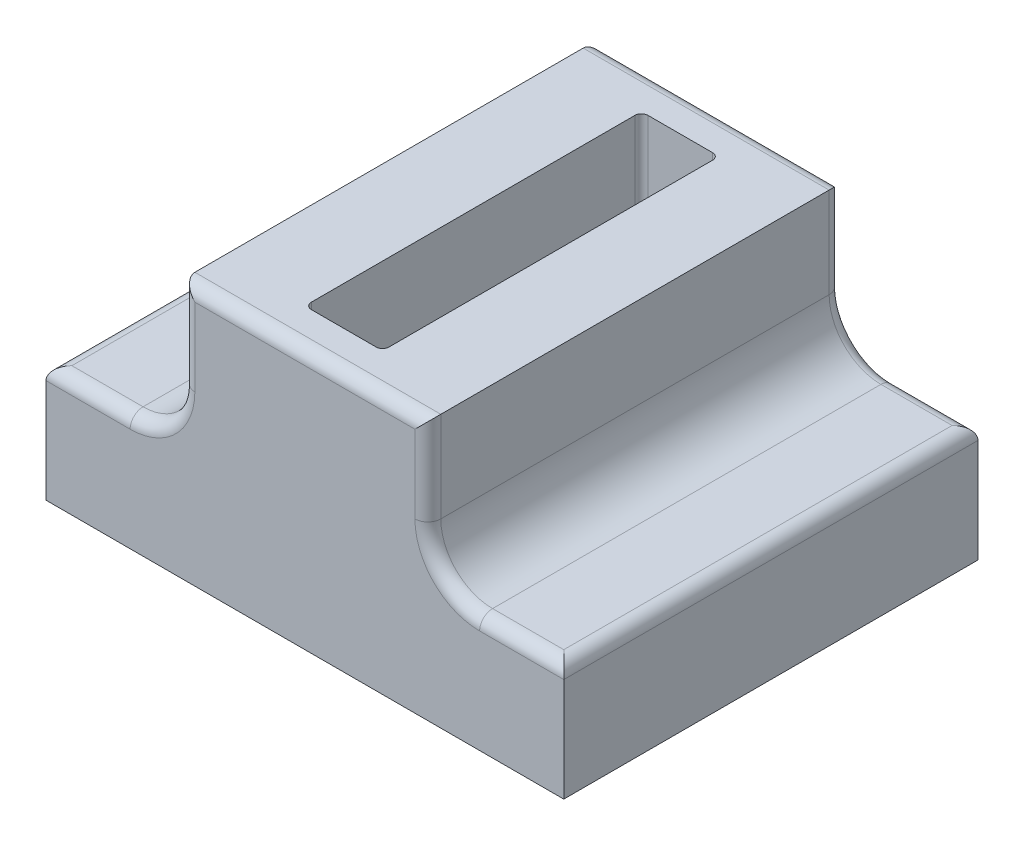
ISO-10303-21;
HEADER;
FILE_DESCRIPTION(('STEP AP214'),'2;1');
FILE_NAME('part.step','',(''),(''),'','','');
FILE_SCHEMA(('AUTOMOTIVE_DESIGN { 1 0 10303 214 1 1 1 1 }'));
ENDSEC;
DATA;
#1=APPLICATION_CONTEXT('core data for automotive mechanical design processes');
#2=APPLICATION_PROTOCOL_DEFINITION('international standard','automotive_design',2000,#1);
#3=PRODUCT_CONTEXT('',#1,'mechanical');
#4=PRODUCT('Part','Part','',(#3));
#5=PRODUCT_RELATED_PRODUCT_CATEGORY('part','',(#4));
#6=PRODUCT_DEFINITION_FORMATION('','',#4);
#7=PRODUCT_DEFINITION_CONTEXT('part definition',#1,'design');
#8=PRODUCT_DEFINITION('design','',#6,#7);
#9=PRODUCT_DEFINITION_SHAPE('','',#8);
#10=(LENGTH_UNIT() NAMED_UNIT(*) SI_UNIT(.MILLI.,.METRE.));
#11=(NAMED_UNIT(*) PLANE_ANGLE_UNIT() SI_UNIT($,.RADIAN.));
#12=(NAMED_UNIT(*) SI_UNIT($,.STERADIAN.) SOLID_ANGLE_UNIT());
#13=UNCERTAINTY_MEASURE_WITH_UNIT(LENGTH_MEASURE(1.E-05),#10,'distance_accuracy_value','');
#14=(GEOMETRIC_REPRESENTATION_CONTEXT(3) GLOBAL_UNCERTAINTY_ASSIGNED_CONTEXT((#13)) GLOBAL_UNIT_ASSIGNED_CONTEXT((#10,
#11,#12)) REPRESENTATION_CONTEXT('',''));
#15=CARTESIAN_POINT('',(0.,0.,0.));
#16=DIRECTION('',(0.,0.,1.));
#17=DIRECTION('',(1.,0.,0.));
#18=AXIS2_PLACEMENT_3D('',#15,#16,#17);
#19=CARTESIAN_POINT('',(0.,4.5,0.));
#20=DIRECTION('',(0.,1.,0.));
#21=DIRECTION('',(0.,0.,1.));
#22=AXIS2_PLACEMENT_3D('',#19,#20,#21);
#23=PLANE('',#22);
#24=DIRECTION('',(0.,0.,1.));
#25=VECTOR('',#24,1.);
#26=CARTESIAN_POINT('',(3.25,4.5,0.));
#27=LINE('',#26,#25);
#28=CARTESIAN_POINT('',(3.25,4.5,15.5));
#29=VERTEX_POINT('',#28);
#30=CARTESIAN_POINT('',(3.25,4.5,0.5));
#31=VERTEX_POINT('',#30);
#32=EDGE_CURVE('E277',#29,#31,#27,.F.);
#33=ORIENTED_EDGE('',*,*,#32,.T.);
#34=DIRECTION('',(-1.,0.,0.));
#35=VECTOR('',#34,1.);
#36=CARTESIAN_POINT('',(0.,4.5,0.5));
#37=LINE('',#36,#35);
#38=CARTESIAN_POINT('',(0.5,4.5,0.5));
#39=VERTEX_POINT('',#38);
#40=EDGE_CURVE('E295',#31,#39,#37,.T.);
#41=ORIENTED_EDGE('',*,*,#40,.T.);
#42=DIRECTION('',(0.,0.,1.));
#43=VECTOR('',#42,1.);
#44=CARTESIAN_POINT('',(0.5,4.5,16.));
#45=LINE('',#44,#43);
#46=CARTESIAN_POINT('',(0.5,4.5,15.5));
#47=VERTEX_POINT('',#46);
#48=EDGE_CURVE('E292',#39,#47,#45,.T.);
#49=ORIENTED_EDGE('',*,*,#48,.T.);
#50=DIRECTION('',(1.,0.,0.));
#51=VECTOR('',#50,1.);
#52=CARTESIAN_POINT('',(3.25,4.5,15.5));
#53=LINE('',#52,#51);
#54=EDGE_CURVE('E289',#47,#29,#53,.T.);
#55=ORIENTED_EDGE('',*,*,#54,.T.);
#56=EDGE_LOOP('',(#33,#41,#49,#55));
#57=FACE_BOUND('',#56,.T.);
#58=ADVANCED_FACE('F48',(#57),#23,.T.);
#59=DIRECTION('',(0.,0.,-1.));
#60=VECTOR('',#59,1.);
#61=CARTESIAN_POINT('',(19.5,4.5,0.));
#62=LINE('',#61,#60);
#63=CARTESIAN_POINT('',(19.5,4.5,15.5));
#64=VERTEX_POINT('',#63);
#65=CARTESIAN_POINT('',(19.5,4.5,0.5));
#66=VERTEX_POINT('',#65);
#67=EDGE_CURVE('E333',#64,#66,#62,.T.);
#68=ORIENTED_EDGE('',*,*,#67,.T.);
#69=DIRECTION('',(-1.,0.,0.));
#70=VECTOR('',#69,1.);
#71=CARTESIAN_POINT('',(16.75,4.5,0.5));
#72=LINE('',#71,#70);
#73=CARTESIAN_POINT('',(16.75,4.5,0.5));
#74=VERTEX_POINT('',#73);
#75=EDGE_CURVE('E339',#66,#74,#72,.T.);
#76=ORIENTED_EDGE('',*,*,#75,.T.);
#77=DIRECTION('',(0.,0.,-1.));
#78=VECTOR('',#77,1.);
#79=CARTESIAN_POINT('',(16.75,4.5,0.));
#80=LINE('',#79,#78);
#81=CARTESIAN_POINT('',(16.75,4.5,15.5));
#82=VERTEX_POINT('',#81);
#83=EDGE_CURVE('E285',#74,#82,#80,.F.);
#84=ORIENTED_EDGE('',*,*,#83,.T.);
#85=DIRECTION('',(1.,0.,0.));
#86=VECTOR('',#85,1.);
#87=CARTESIAN_POINT('',(20.,4.5,15.5));
#88=LINE('',#87,#86);
#89=EDGE_CURVE('E336',#82,#64,#88,.T.);
#90=ORIENTED_EDGE('',*,*,#89,.T.);
#91=EDGE_LOOP('',(#68,#76,#84,#90));
#92=FACE_BOUND('',#91,.T.);
#93=ADVANCED_FACE('F569',(#92),#23,.T.);
#94=CARTESIAN_POINT('',(0.,0.,0.));
#95=DIRECTION('',(0.,1.,0.));
#96=DIRECTION('',(0.,0.,1.));
#97=AXIS2_PLACEMENT_3D('',#94,#95,#96);
#98=PLANE('',#97);
#99=DIRECTION('',(0.,0.,1.));
#100=VECTOR('',#99,1.);
#101=CARTESIAN_POINT('',(0.,0.,0.));
#102=LINE('',#101,#100);
#103=CARTESIAN_POINT('',(0.,0.,0.));
#104=VERTEX_POINT('',#103);
#105=CARTESIAN_POINT('',(0.,0.,16.));
#106=VERTEX_POINT('',#105);
#107=EDGE_CURVE('E244',#104,#106,#102,.T.);
#108=ORIENTED_EDGE('',*,*,#107,.F.);
#109=DIRECTION('',(-1.,0.,0.));
#110=VECTOR('',#109,1.);
#111=CARTESIAN_POINT('',(0.,0.,0.));
#112=LINE('',#111,#110);
#113=CARTESIAN_POINT('',(20.,0.,0.));
#114=VERTEX_POINT('',#113);
#115=EDGE_CURVE('E264',#114,#104,#112,.T.);
#116=ORIENTED_EDGE('',*,*,#115,.F.);
#117=DIRECTION('',(0.,0.,-1.));
#118=VECTOR('',#117,1.);
#119=CARTESIAN_POINT('',(20.,0.,0.));
#120=LINE('',#119,#118);
#121=CARTESIAN_POINT('',(20.,0.,16.));
#122=VERTEX_POINT('',#121);
#123=EDGE_CURVE('E246',#122,#114,#120,.T.);
#124=ORIENTED_EDGE('',*,*,#123,.F.);
#125=DIRECTION('',(1.,0.,0.));
#126=VECTOR('',#125,1.);
#127=CARTESIAN_POINT('',(0.,0.,16.));
#128=LINE('',#127,#126);
#129=EDGE_CURVE('E228',#106,#122,#128,.T.);
#130=ORIENTED_EDGE('',*,*,#129,.F.);
#131=EDGE_LOOP('',(#108,#116,#124,#130));
#132=FACE_BOUND('',#131,.T.);
#133=DIRECTION('',(-1.,0.,0.));
#134=VECTOR('',#133,1.);
#135=CARTESIAN_POINT('',(8.5,0.,1.5));
#136=LINE('',#135,#134);
#137=CARTESIAN_POINT('',(11.25,0.,1.5));
#138=VERTEX_POINT('',#137);
#139=CARTESIAN_POINT('',(8.75,0.,1.5));
#140=VERTEX_POINT('',#139);
#141=EDGE_CURVE('E254',#138,#140,#136,.T.);
#142=ORIENTED_EDGE('',*,*,#141,.T.);
#143=CARTESIAN_POINT('',(8.75,0.,1.75));
#144=DIRECTION('',(0.,1.,0.));
#145=DIRECTION('',(0.,0.,1.));
#146=AXIS2_PLACEMENT_3D('',#143,#144,#145);
#147=CIRCLE('',#146,0.25);
#148=CARTESIAN_POINT('',(8.5,0.,1.75));
#149=VERTEX_POINT('',#148);
#150=EDGE_CURVE('E57',#140,#149,#147,.T.);
#151=ORIENTED_EDGE('',*,*,#150,.T.);
#152=DIRECTION('',(0.,0.,1.));
#153=VECTOR('',#152,1.);
#154=CARTESIAN_POINT('',(8.5,0.,1.5));
#155=LINE('',#154,#153);
#156=CARTESIAN_POINT('',(8.5,0.,14.25));
#157=VERTEX_POINT('',#156);
#158=EDGE_CURVE('E496',#149,#157,#155,.T.);
#159=ORIENTED_EDGE('',*,*,#158,.T.);
#160=CARTESIAN_POINT('',(8.75,0.,14.25));
#161=DIRECTION('',(0.,1.,0.));
#162=DIRECTION('',(0.,0.,1.));
#163=AXIS2_PLACEMENT_3D('',#160,#161,#162);
#164=CIRCLE('',#163,0.25);
#165=CARTESIAN_POINT('',(8.75,0.,14.5));
#166=VERTEX_POINT('',#165);
#167=EDGE_CURVE('E476',#157,#166,#164,.T.);
#168=ORIENTED_EDGE('',*,*,#167,.T.);
#169=DIRECTION('',(1.,0.,0.));
#170=VECTOR('',#169,1.);
#171=CARTESIAN_POINT('',(8.5,0.,14.5));
#172=LINE('',#171,#170);
#173=CARTESIAN_POINT('',(11.25,0.,14.5));
#174=VERTEX_POINT('',#173);
#175=EDGE_CURVE('E505',#166,#174,#172,.T.);
#176=ORIENTED_EDGE('',*,*,#175,.T.);
#177=CARTESIAN_POINT('',(11.25,0.,14.25));
#178=DIRECTION('',(0.,1.,0.));
#179=DIRECTION('',(0.,0.,1.));
#180=AXIS2_PLACEMENT_3D('',#177,#178,#179);
#181=CIRCLE('',#180,0.25);
#182=CARTESIAN_POINT('',(11.5,0.,14.25));
#183=VERTEX_POINT('',#182);
#184=EDGE_CURVE('E482',#174,#183,#181,.T.);
#185=ORIENTED_EDGE('',*,*,#184,.T.);
#186=DIRECTION('',(0.,0.,-1.));
#187=VECTOR('',#186,1.);
#188=CARTESIAN_POINT('',(11.5,0.,1.5));
#189=LINE('',#188,#187);
#190=CARTESIAN_POINT('',(11.5,0.,1.75));
#191=VERTEX_POINT('',#190);
#192=EDGE_CURVE('E258',#183,#191,#189,.T.);
#193=ORIENTED_EDGE('',*,*,#192,.T.);
#194=CARTESIAN_POINT('',(11.25,0.,1.75));
#195=DIRECTION('',(0.,1.,0.));
#196=DIRECTION('',(0.,0.,1.));
#197=AXIS2_PLACEMENT_3D('',#194,#195,#196);
#198=CIRCLE('',#197,0.25);
#199=EDGE_CURVE('E488',#191,#138,#198,.T.);
#200=ORIENTED_EDGE('',*,*,#199,.T.);
#201=EDGE_LOOP('',(#142,#151,#159,#168,#176,#185,#193,#200));
#202=FACE_BOUND('',#201,.T.);
#203=ADVANCED_FACE('F241',(#132,#202),#98,.F.);
#204=CARTESIAN_POINT('',(0.,4.5,0.));
#205=DIRECTION('',(1.,0.,0.));
#206=DIRECTION('',(0.,0.,-1.));
#207=AXIS2_PLACEMENT_3D('',#204,#205,#206);
#208=PLANE('',#207);
#209=DIRECTION('',(0.,-1.,0.));
#210=VECTOR('',#209,1.);
#211=CARTESIAN_POINT('',(0.,4.5,16.));
#212=LINE('',#211,#210);
#213=CARTESIAN_POINT('',(0.,4.,16.));
#214=VERTEX_POINT('',#213);
#215=EDGE_CURVE('E224',#214,#106,#212,.T.);
#216=ORIENTED_EDGE('',*,*,#215,.F.);
#217=DIRECTION('',(0.,0.,1.));
#218=VECTOR('',#217,1.);
#219=CARTESIAN_POINT('',(0.,4.,0.));
#220=LINE('',#219,#218);
#221=CARTESIAN_POINT('',(0.,4.,0.));
#222=VERTEX_POINT('',#221);
#223=EDGE_CURVE('E368',#214,#222,#220,.F.);
#224=ORIENTED_EDGE('',*,*,#223,.T.);
#225=DIRECTION('',(0.,-1.,0.));
#226=VECTOR('',#225,1.);
#227=CARTESIAN_POINT('',(0.,4.5,0.));
#228=LINE('',#227,#226);
#229=EDGE_CURVE('E251',#222,#104,#228,.T.);
#230=ORIENTED_EDGE('',*,*,#229,.T.);
#231=ORIENTED_EDGE('',*,*,#107,.T.);
#232=EDGE_LOOP('',(#216,#224,#230,#231));
#233=FACE_BOUND('',#232,.T.);
#234=ADVANCED_FACE('F249',(#233),#208,.F.);
#235=CARTESIAN_POINT('',(0.,4.5,16.));
#236=DIRECTION('',(0.,0.,-1.));
#237=DIRECTION('',(-1.,0.,0.));
#238=AXIS2_PLACEMENT_3D('',#235,#236,#237);
#239=PLANE('',#238);
#240=DIRECTION('',(0.,-1.,0.));
#241=VECTOR('',#240,1.);
#242=CARTESIAN_POINT('',(20.,4.5,16.));
#243=LINE('',#242,#241);
#244=CARTESIAN_POINT('',(20.,4.,16.));
#245=VERTEX_POINT('',#244);
#246=EDGE_CURVE('E237',#245,#122,#243,.T.);
#247=ORIENTED_EDGE('',*,*,#246,.F.);
#248=DIRECTION('',(1.,0.,0.));
#249=VECTOR('',#248,1.);
#250=CARTESIAN_POINT('',(16.75,4.,16.));
#251=LINE('',#250,#249);
#252=CARTESIAN_POINT('',(16.75,4.,16.));
#253=VERTEX_POINT('',#252);
#254=EDGE_CURVE('E359',#245,#253,#251,.F.);
#255=ORIENTED_EDGE('',*,*,#254,.T.);
#256=CARTESIAN_POINT('',(16.75,6.5,16.));
#257=DIRECTION('',(0.,0.,-1.));
#258=DIRECTION('',(-1.,0.,0.));
#259=AXIS2_PLACEMENT_3D('',#256,#257,#258);
#260=CIRCLE('',#259,2.5);
#261=CARTESIAN_POINT('',(14.25,6.5,16.));
#262=VERTEX_POINT('',#261);
#263=EDGE_CURVE('E356',#253,#262,#260,.T.);
#264=ORIENTED_EDGE('',*,*,#263,.T.);
#265=DIRECTION('',(0.,-1.,0.));
#266=VECTOR('',#265,1.);
#267=CARTESIAN_POINT('',(14.25,4.5,16.));
#268=LINE('',#267,#266);
#269=CARTESIAN_POINT('',(14.25,9.5,16.));
#270=VERTEX_POINT('',#269);
#271=EDGE_CURVE('E353',#262,#270,#268,.F.);
#272=ORIENTED_EDGE('',*,*,#271,.T.);
#273=DIRECTION('',(1.,0.,0.));
#274=VECTOR('',#273,1.);
#275=CARTESIAN_POINT('',(5.25,9.5,16.));
#276=LINE('',#275,#274);
#277=CARTESIAN_POINT('',(5.75,9.5,16.));
#278=VERTEX_POINT('',#277);
#279=EDGE_CURVE('E350',#270,#278,#276,.F.);
#280=ORIENTED_EDGE('',*,*,#279,.T.);
#281=DIRECTION('',(0.,-1.,0.));
#282=VECTOR('',#281,1.);
#283=CARTESIAN_POINT('',(5.75,4.5,16.));
#284=LINE('',#283,#282);
#285=CARTESIAN_POINT('',(5.75,6.5,16.));
#286=VERTEX_POINT('',#285);
#287=EDGE_CURVE('E347',#278,#286,#284,.T.);
#288=ORIENTED_EDGE('',*,*,#287,.T.);
#289=CARTESIAN_POINT('',(3.25,6.5,16.));
#290=DIRECTION('',(0.,0.,-1.));
#291=DIRECTION('',(-1.,0.,0.));
#292=AXIS2_PLACEMENT_3D('',#289,#290,#291);
#293=CIRCLE('',#292,2.5);
#294=CARTESIAN_POINT('',(3.25,4.,16.));
#295=VERTEX_POINT('',#294);
#296=EDGE_CURVE('E344',#286,#295,#293,.T.);
#297=ORIENTED_EDGE('',*,*,#296,.T.);
#298=DIRECTION('',(1.,0.,0.));
#299=VECTOR('',#298,1.);
#300=CARTESIAN_POINT('',(0.,4.,16.));
#301=LINE('',#300,#299);
#302=EDGE_CURVE('E231',#295,#214,#301,.F.);
#303=ORIENTED_EDGE('',*,*,#302,.T.);
#304=ORIENTED_EDGE('',*,*,#215,.T.);
#305=ORIENTED_EDGE('',*,*,#129,.T.);
#306=EDGE_LOOP('',(#247,#255,#264,#272,#280,#288,#297,#303,#304,#305));
#307=FACE_BOUND('',#306,.T.);
#308=ADVANCED_FACE('F227',(#307),#239,.F.);
#309=CARTESIAN_POINT('',(20.,4.5,0.));
#310=DIRECTION('',(-1.,0.,0.));
#311=DIRECTION('',(0.,0.,1.));
#312=AXIS2_PLACEMENT_3D('',#309,#310,#311);
#313=PLANE('',#312);
#314=DIRECTION('',(0.,-1.,0.));
#315=VECTOR('',#314,1.);
#316=CARTESIAN_POINT('',(20.,4.5,0.));
#317=LINE('',#316,#315);
#318=CARTESIAN_POINT('',(20.,4.,0.));
#319=VERTEX_POINT('',#318);
#320=EDGE_CURVE('E269',#319,#114,#317,.T.);
#321=ORIENTED_EDGE('',*,*,#320,.F.);
#322=DIRECTION('',(0.,0.,-1.));
#323=VECTOR('',#322,1.);
#324=CARTESIAN_POINT('',(20.,4.,16.));
#325=LINE('',#324,#323);
#326=EDGE_CURVE('E371',#319,#245,#325,.F.);
#327=ORIENTED_EDGE('',*,*,#326,.T.);
#328=ORIENTED_EDGE('',*,*,#246,.T.);
#329=ORIENTED_EDGE('',*,*,#123,.T.);
#330=EDGE_LOOP('',(#321,#327,#328,#329));
#331=FACE_BOUND('',#330,.T.);
#332=ADVANCED_FACE('F584',(#331),#313,.F.);
#333=CARTESIAN_POINT('',(0.,4.5,0.));
#334=DIRECTION('',(0.,0.,1.));
#335=DIRECTION('',(1.,0.,0.));
#336=AXIS2_PLACEMENT_3D('',#333,#334,#335);
#337=PLANE('',#336);
#338=ORIENTED_EDGE('',*,*,#229,.F.);
#339=DIRECTION('',(-1.,0.,0.));
#340=VECTOR('',#339,1.);
#341=CARTESIAN_POINT('',(3.25,4.,0.));
#342=LINE('',#341,#340);
#343=CARTESIAN_POINT('',(3.25,4.,0.));
#344=VERTEX_POINT('',#343);
#345=EDGE_CURVE('E317',#222,#344,#342,.F.);
#346=ORIENTED_EDGE('',*,*,#345,.T.);
#347=CARTESIAN_POINT('',(3.25,6.5,0.));
#348=DIRECTION('',(0.,0.,1.));
#349=DIRECTION('',(1.,0.,0.));
#350=AXIS2_PLACEMENT_3D('',#347,#348,#349);
#351=CIRCLE('',#350,2.5);
#352=CARTESIAN_POINT('',(5.75,6.5,0.));
#353=VERTEX_POINT('',#352);
#354=EDGE_CURVE('E314',#344,#353,#351,.T.);
#355=ORIENTED_EDGE('',*,*,#354,.T.);
#356=DIRECTION('',(0.,-1.,0.));
#357=VECTOR('',#356,1.);
#358=CARTESIAN_POINT('',(5.75,4.5,0.));
#359=LINE('',#358,#357);
#360=CARTESIAN_POINT('',(5.75,9.5,0.));
#361=VERTEX_POINT('',#360);
#362=EDGE_CURVE('E311',#353,#361,#359,.F.);
#363=ORIENTED_EDGE('',*,*,#362,.T.);
#364=DIRECTION('',(-1.,0.,0.));
#365=VECTOR('',#364,1.);
#366=CARTESIAN_POINT('',(14.75,9.5,0.));
#367=LINE('',#366,#365);
#368=CARTESIAN_POINT('',(14.25,9.5,0.));
#369=VERTEX_POINT('',#368);
#370=EDGE_CURVE('E308',#361,#369,#367,.F.);
#371=ORIENTED_EDGE('',*,*,#370,.T.);
#372=DIRECTION('',(0.,-1.,0.));
#373=VECTOR('',#372,1.);
#374=CARTESIAN_POINT('',(14.25,4.5,0.));
#375=LINE('',#374,#373);
#376=CARTESIAN_POINT('',(14.25,6.5,0.));
#377=VERTEX_POINT('',#376);
#378=EDGE_CURVE('E305',#369,#377,#375,.T.);
#379=ORIENTED_EDGE('',*,*,#378,.T.);
#380=CARTESIAN_POINT('',(16.75,6.5,0.));
#381=DIRECTION('',(0.,0.,1.));
#382=DIRECTION('',(1.,0.,0.));
#383=AXIS2_PLACEMENT_3D('',#380,#381,#382);
#384=CIRCLE('',#383,2.5);
#385=CARTESIAN_POINT('',(16.75,4.,0.));
#386=VERTEX_POINT('',#385);
#387=EDGE_CURVE('E299',#377,#386,#384,.T.);
#388=ORIENTED_EDGE('',*,*,#387,.T.);
#389=DIRECTION('',(-1.,0.,0.));
#390=VECTOR('',#389,1.);
#391=CARTESIAN_POINT('',(20.,4.,0.));
#392=LINE('',#391,#390);
#393=EDGE_CURVE('E302',#386,#319,#392,.F.);
#394=ORIENTED_EDGE('',*,*,#393,.T.);
#395=ORIENTED_EDGE('',*,*,#320,.T.);
#396=ORIENTED_EDGE('',*,*,#115,.T.);
#397=EDGE_LOOP('',(#338,#346,#355,#363,#371,#379,#388,#394,#395,#396));
#398=FACE_BOUND('',#397,.T.);
#399=ADVANCED_FACE('F581',(#398),#337,.F.);
#400=CARTESIAN_POINT('',(8.5,4.5,1.5));
#401=DIRECTION('',(1.,0.,0.));
#402=DIRECTION('',(0.,0.,-1.));
#403=AXIS2_PLACEMENT_3D('',#400,#401,#402);
#404=PLANE('',#403);
#405=DIRECTION('',(0.,0.,1.));
#406=VECTOR('',#405,1.);
#407=CARTESIAN_POINT('',(8.5,10.,1.5));
#408=LINE('',#407,#406);
#409=CARTESIAN_POINT('',(8.5,10.,1.75));
#410=VERTEX_POINT('',#409);
#411=CARTESIAN_POINT('',(8.5,10.,14.25));
#412=VERTEX_POINT('',#411);
#413=EDGE_CURVE('E449',#410,#412,#408,.T.);
#414=ORIENTED_EDGE('',*,*,#413,.T.);
#415=DIRECTION('',(0.,-1.,0.));
#416=VECTOR('',#415,1.);
#417=CARTESIAN_POINT('',(8.5,0.,14.25));
#418=LINE('',#417,#416);
#419=EDGE_CURVE('E452',#412,#157,#418,.T.);
#420=ORIENTED_EDGE('',*,*,#419,.T.);
#421=ORIENTED_EDGE('',*,*,#158,.F.);
#422=DIRECTION('',(0.,-1.,0.));
#423=VECTOR('',#422,1.);
#424=CARTESIAN_POINT('',(8.5,10.,1.75));
#425=LINE('',#424,#423);
#426=EDGE_CURVE('E386',#149,#410,#425,.F.);
#427=ORIENTED_EDGE('',*,*,#426,.T.);
#428=EDGE_LOOP('',(#414,#420,#421,#427));
#429=FACE_BOUND('',#428,.T.);
#430=ADVANCED_FACE('F502',(#429),#404,.T.);
#431=CARTESIAN_POINT('',(8.5,4.5,14.5));
#432=DIRECTION('',(0.,0.,-1.));
#433=DIRECTION('',(-1.,0.,0.));
#434=AXIS2_PLACEMENT_3D('',#431,#432,#433);
#435=PLANE('',#434);
#436=ORIENTED_EDGE('',*,*,#175,.F.);
#437=DIRECTION('',(0.,-1.,0.));
#438=VECTOR('',#437,1.);
#439=CARTESIAN_POINT('',(8.75,10.,14.5));
#440=LINE('',#439,#438);
#441=CARTESIAN_POINT('',(8.75,10.,14.5));
#442=VERTEX_POINT('',#441);
#443=EDGE_CURVE('E460',#166,#442,#440,.F.);
#444=ORIENTED_EDGE('',*,*,#443,.T.);
#445=DIRECTION('',(1.,0.,0.));
#446=VECTOR('',#445,1.);
#447=CARTESIAN_POINT('',(8.5,10.,14.5));
#448=LINE('',#447,#446);
#449=CARTESIAN_POINT('',(11.25,10.,14.5));
#450=VERTEX_POINT('',#449);
#451=EDGE_CURVE('E520',#442,#450,#448,.T.);
#452=ORIENTED_EDGE('',*,*,#451,.T.);
#453=DIRECTION('',(0.,-1.,0.));
#454=VECTOR('',#453,1.);
#455=CARTESIAN_POINT('',(11.25,0.,14.5));
#456=LINE('',#455,#454);
#457=EDGE_CURVE('E456',#450,#174,#456,.T.);
#458=ORIENTED_EDGE('',*,*,#457,.T.);
#459=EDGE_LOOP('',(#436,#444,#452,#458));
#460=FACE_BOUND('',#459,.T.);
#461=ADVANCED_FACE('F547',(#460),#435,.T.);
#462=CARTESIAN_POINT('',(11.5,4.5,1.5));
#463=DIRECTION('',(-1.,0.,0.));
#464=DIRECTION('',(0.,0.,1.));
#465=AXIS2_PLACEMENT_3D('',#462,#463,#464);
#466=PLANE('',#465);
#467=ORIENTED_EDGE('',*,*,#192,.F.);
#468=DIRECTION('',(0.,-1.,0.));
#469=VECTOR('',#468,1.);
#470=CARTESIAN_POINT('',(11.5,10.,14.25));
#471=LINE('',#470,#469);
#472=CARTESIAN_POINT('',(11.5,10.,14.25));
#473=VERTEX_POINT('',#472);
#474=EDGE_CURVE('E467',#183,#473,#471,.F.);
#475=ORIENTED_EDGE('',*,*,#474,.T.);
#476=DIRECTION('',(0.,0.,-1.));
#477=VECTOR('',#476,1.);
#478=CARTESIAN_POINT('',(11.5,10.,1.5));
#479=LINE('',#478,#477);
#480=CARTESIAN_POINT('',(11.5,10.,1.75));
#481=VERTEX_POINT('',#480);
#482=EDGE_CURVE('E513',#473,#481,#479,.T.);
#483=ORIENTED_EDGE('',*,*,#482,.T.);
#484=DIRECTION('',(0.,-1.,0.));
#485=VECTOR('',#484,1.);
#486=CARTESIAN_POINT('',(11.5,0.,1.75));
#487=LINE('',#486,#485);
#488=EDGE_CURVE('E463',#481,#191,#487,.T.);
#489=ORIENTED_EDGE('',*,*,#488,.T.);
#490=EDGE_LOOP('',(#467,#475,#483,#489));
#491=FACE_BOUND('',#490,.T.);
#492=ADVANCED_FACE('F534',(#491),#466,.T.);
#493=CARTESIAN_POINT('',(8.5,4.5,1.5));
#494=DIRECTION('',(0.,0.,1.));
#495=DIRECTION('',(1.,0.,0.));
#496=AXIS2_PLACEMENT_3D('',#493,#494,#495);
#497=PLANE('',#496);
#498=ORIENTED_EDGE('',*,*,#141,.F.);
#499=DIRECTION('',(0.,-1.,0.));
#500=VECTOR('',#499,1.);
#501=CARTESIAN_POINT('',(11.25,10.,1.5));
#502=LINE('',#501,#500);
#503=CARTESIAN_POINT('',(11.25,10.,1.5));
#504=VERTEX_POINT('',#503);
#505=EDGE_CURVE('E69',#138,#504,#502,.F.);
#506=ORIENTED_EDGE('',*,*,#505,.T.);
#507=DIRECTION('',(-1.,0.,0.));
#508=VECTOR('',#507,1.);
#509=CARTESIAN_POINT('',(8.5,10.,1.5));
#510=LINE('',#509,#508);
#511=CARTESIAN_POINT('',(8.75,10.,1.5));
#512=VERTEX_POINT('',#511);
#513=EDGE_CURVE('E509',#504,#512,#510,.T.);
#514=ORIENTED_EDGE('',*,*,#513,.T.);
#515=DIRECTION('',(0.,-1.,0.));
#516=VECTOR('',#515,1.);
#517=CARTESIAN_POINT('',(8.75,0.,1.5));
#518=LINE('',#517,#516);
#519=EDGE_CURVE('E470',#512,#140,#518,.T.);
#520=ORIENTED_EDGE('',*,*,#519,.T.);
#521=EDGE_LOOP('',(#498,#506,#514,#520));
#522=FACE_BOUND('',#521,.T.);
#523=ADVANCED_FACE('F508',(#522),#497,.T.);
#524=CARTESIAN_POINT('',(0.,10.,0.));
#525=DIRECTION('',(0.,1.,0.));
#526=DIRECTION('',(0.,0.,1.));
#527=AXIS2_PLACEMENT_3D('',#524,#525,#526);
#528=PLANE('',#527);
#529=DIRECTION('',(0.,0.,-1.));
#530=VECTOR('',#529,1.);
#531=CARTESIAN_POINT('',(14.75,10.,0.));
#532=LINE('',#531,#530);
#533=CARTESIAN_POINT('',(14.75,10.,15.5));
#534=VERTEX_POINT('',#533);
#535=CARTESIAN_POINT('',(14.75,10.,0.5));
#536=VERTEX_POINT('',#535);
#537=EDGE_CURVE('E506',#534,#536,#532,.T.);
#538=ORIENTED_EDGE('',*,*,#537,.T.);
#539=DIRECTION('',(-1.,0.,0.));
#540=VECTOR('',#539,1.);
#541=CARTESIAN_POINT('',(5.25,10.,0.5));
#542=LINE('',#541,#540);
#543=CARTESIAN_POINT('',(5.25,10.,0.5));
#544=VERTEX_POINT('',#543);
#545=EDGE_CURVE('E377',#536,#544,#542,.T.);
#546=ORIENTED_EDGE('',*,*,#545,.T.);
#547=DIRECTION('',(0.,0.,1.));
#548=VECTOR('',#547,1.);
#549=CARTESIAN_POINT('',(5.25,10.,0.));
#550=LINE('',#549,#548);
#551=CARTESIAN_POINT('',(5.25,10.,15.5));
#552=VERTEX_POINT('',#551);
#553=EDGE_CURVE('E512',#544,#552,#550,.T.);
#554=ORIENTED_EDGE('',*,*,#553,.T.);
#555=DIRECTION('',(1.,0.,0.));
#556=VECTOR('',#555,1.);
#557=CARTESIAN_POINT('',(14.75,10.,15.5));
#558=LINE('',#557,#556);
#559=EDGE_CURVE('E374',#552,#534,#558,.T.);
#560=ORIENTED_EDGE('',*,*,#559,.T.);
#561=EDGE_LOOP('',(#538,#546,#554,#560));
#562=FACE_BOUND('',#561,.T.);
#563=ORIENTED_EDGE('',*,*,#451,.F.);
#564=CARTESIAN_POINT('',(8.75,10.,14.25));
#565=DIRECTION('',(0.,1.,0.));
#566=DIRECTION('',(0.,0.,1.));
#567=AXIS2_PLACEMENT_3D('',#564,#565,#566);
#568=CIRCLE('',#567,0.25);
#569=EDGE_CURVE('E479',#442,#412,#568,.F.);
#570=ORIENTED_EDGE('',*,*,#569,.T.);
#571=ORIENTED_EDGE('',*,*,#413,.F.);
#572=CARTESIAN_POINT('',(8.75,10.,1.75));
#573=DIRECTION('',(0.,1.,0.));
#574=DIRECTION('',(0.,0.,1.));
#575=AXIS2_PLACEMENT_3D('',#572,#573,#574);
#576=CIRCLE('',#575,0.25);
#577=EDGE_CURVE('E11',#410,#512,#576,.F.);
#578=ORIENTED_EDGE('',*,*,#577,.T.);
#579=ORIENTED_EDGE('',*,*,#513,.F.);
#580=CARTESIAN_POINT('',(11.25,10.,1.75));
#581=DIRECTION('',(0.,1.,0.));
#582=DIRECTION('',(0.,0.,1.));
#583=AXIS2_PLACEMENT_3D('',#580,#581,#582);
#584=CIRCLE('',#583,0.25);
#585=EDGE_CURVE('E491',#504,#481,#584,.F.);
#586=ORIENTED_EDGE('',*,*,#585,.T.);
#587=ORIENTED_EDGE('',*,*,#482,.F.);
#588=CARTESIAN_POINT('',(11.25,10.,14.25));
#589=DIRECTION('',(0.,1.,0.));
#590=DIRECTION('',(0.,0.,1.));
#591=AXIS2_PLACEMENT_3D('',#588,#589,#590);
#592=CIRCLE('',#591,0.25);
#593=EDGE_CURVE('E485',#473,#450,#592,.F.);
#594=ORIENTED_EDGE('',*,*,#593,.T.);
#595=EDGE_LOOP('',(#563,#570,#571,#578,#579,#586,#587,#594));
#596=FACE_BOUND('',#595,.T.);
#597=ADVANCED_FACE('F543',(#562,#596),#528,.T.);
#598=CARTESIAN_POINT('',(5.25,10.,0.));
#599=DIRECTION('',(1.,0.,0.));
#600=DIRECTION('',(0.,0.,-1.));
#601=AXIS2_PLACEMENT_3D('',#598,#599,#600);
#602=PLANE('',#601);
#603=ORIENTED_EDGE('',*,*,#553,.F.);
#604=DIRECTION('',(0.,-1.,0.));
#605=VECTOR('',#604,1.);
#606=CARTESIAN_POINT('',(5.25,10.,0.5));
#607=LINE('',#606,#605);
#608=CARTESIAN_POINT('',(5.25,6.5,0.5));
#609=VERTEX_POINT('',#608);
#610=EDGE_CURVE('E324',#544,#609,#607,.T.);
#611=ORIENTED_EDGE('',*,*,#610,.T.);
#612=DIRECTION('',(0.,0.,1.));
#613=VECTOR('',#612,1.);
#614=CARTESIAN_POINT('',(5.25,6.5,0.));
#615=LINE('',#614,#613);
#616=CARTESIAN_POINT('',(5.25,6.5,15.5));
#617=VERTEX_POINT('',#616);
#618=EDGE_CURVE('E236',#609,#617,#615,.T.);
#619=ORIENTED_EDGE('',*,*,#618,.T.);
#620=DIRECTION('',(0.,-1.,0.));
#621=VECTOR('',#620,1.);
#622=CARTESIAN_POINT('',(5.25,10.,15.5));
#623=LINE('',#622,#621);
#624=EDGE_CURVE('E321',#617,#552,#623,.F.);
#625=ORIENTED_EDGE('',*,*,#624,.T.);
#626=EDGE_LOOP('',(#603,#611,#619,#625));
#627=FACE_BOUND('',#626,.T.);
#628=ADVANCED_FACE('F715',(#627),#602,.F.);
#629=CARTESIAN_POINT('',(14.75,10.,0.));
#630=DIRECTION('',(-1.,0.,0.));
#631=DIRECTION('',(0.,0.,1.));
#632=AXIS2_PLACEMENT_3D('',#629,#630,#631);
#633=PLANE('',#632);
#634=DIRECTION('',(0.,0.,-1.));
#635=VECTOR('',#634,1.);
#636=CARTESIAN_POINT('',(14.75,6.5,0.));
#637=LINE('',#636,#635);
#638=CARTESIAN_POINT('',(14.75,6.5,15.5));
#639=VERTEX_POINT('',#638);
#640=CARTESIAN_POINT('',(14.75,6.5,0.5));
#641=VERTEX_POINT('',#640);
#642=EDGE_CURVE('E281',#639,#641,#637,.T.);
#643=ORIENTED_EDGE('',*,*,#642,.T.);
#644=DIRECTION('',(0.,-1.,0.));
#645=VECTOR('',#644,1.);
#646=CARTESIAN_POINT('',(14.75,10.,0.5));
#647=LINE('',#646,#645);
#648=EDGE_CURVE('E330',#641,#536,#647,.F.);
#649=ORIENTED_EDGE('',*,*,#648,.T.);
#650=ORIENTED_EDGE('',*,*,#537,.F.);
#651=DIRECTION('',(0.,-1.,0.));
#652=VECTOR('',#651,1.);
#653=CARTESIAN_POINT('',(14.75,10.,15.5));
#654=LINE('',#653,#652);
#655=EDGE_CURVE('E327',#534,#639,#654,.T.);
#656=ORIENTED_EDGE('',*,*,#655,.T.);
#657=EDGE_LOOP('',(#643,#649,#650,#656));
#658=FACE_BOUND('',#657,.T.);
#659=ADVANCED_FACE('F597',(#658),#633,.F.);
#660=CARTESIAN_POINT('',(3.25,6.5,0.));
#661=DIRECTION('',(0.,0.,1.));
#662=DIRECTION('',(1.,0.,0.));
#663=AXIS2_PLACEMENT_3D('',#660,#661,#662);
#664=CYLINDRICAL_SURFACE('',#663,2.);
#665=ORIENTED_EDGE('',*,*,#32,.F.);
#666=CARTESIAN_POINT('',(3.25,6.5,15.5));
#667=DIRECTION('',(0.,0.,-1.));
#668=DIRECTION('',(-1.,0.,0.));
#669=AXIS2_PLACEMENT_3D('',#666,#667,#668);
#670=CIRCLE('',#669,2.);
#671=EDGE_CURVE('E365',#29,#617,#670,.F.);
#672=ORIENTED_EDGE('',*,*,#671,.T.);
#673=ORIENTED_EDGE('',*,*,#618,.F.);
#674=CARTESIAN_POINT('',(3.25,6.5,0.5));
#675=DIRECTION('',(0.,0.,1.));
#676=DIRECTION('',(1.,0.,0.));
#677=AXIS2_PLACEMENT_3D('',#674,#675,#676);
#678=CIRCLE('',#677,2.);
#679=EDGE_CURVE('E362',#609,#31,#678,.F.);
#680=ORIENTED_EDGE('',*,*,#679,.T.);
#681=EDGE_LOOP('',(#665,#672,#673,#680));
#682=FACE_BOUND('',#681,.T.);
#683=ADVANCED_FACE('F593',(#682),#664,.F.);
#684=CARTESIAN_POINT('',(16.75,6.5,0.));
#685=DIRECTION('',(0.,0.,-1.));
#686=DIRECTION('',(-1.,0.,0.));
#687=AXIS2_PLACEMENT_3D('',#684,#685,#686);
#688=CYLINDRICAL_SURFACE('',#687,2.);
#689=ORIENTED_EDGE('',*,*,#83,.F.);
#690=CARTESIAN_POINT('',(16.75,6.5,0.5));
#691=DIRECTION('',(0.,0.,1.));
#692=DIRECTION('',(1.,0.,0.));
#693=AXIS2_PLACEMENT_3D('',#690,#691,#692);
#694=CIRCLE('',#693,2.);
#695=EDGE_CURVE('E383',#74,#641,#694,.F.);
#696=ORIENTED_EDGE('',*,*,#695,.T.);
#697=ORIENTED_EDGE('',*,*,#642,.F.);
#698=CARTESIAN_POINT('',(16.75,6.5,15.5));
#699=DIRECTION('',(0.,0.,-1.));
#700=DIRECTION('',(-1.,0.,0.));
#701=AXIS2_PLACEMENT_3D('',#698,#699,#700);
#702=CIRCLE('',#701,2.);
#703=EDGE_CURVE('E380',#639,#82,#702,.F.);
#704=ORIENTED_EDGE('',*,*,#703,.T.);
#705=EDGE_LOOP('',(#689,#696,#697,#704));
#706=FACE_BOUND('',#705,.T.);
#707=ADVANCED_FACE('F596',(#706),#688,.F.);
#708=CARTESIAN_POINT('',(0.,4.,15.5));
#709=DIRECTION('',(-1.,0.,0.));
#710=DIRECTION('',(0.,0.,1.));
#711=AXIS2_PLACEMENT_3D('',#708,#709,#710);
#712=CYLINDRICAL_SURFACE('',#711,0.5);
#713=CARTESIAN_POINT('',(16.75,4.,15.5));
#714=DIRECTION('',(-1.,0.,0.));
#715=DIRECTION('',(0.,0.,1.));
#716=AXIS2_PLACEMENT_3D('',#713,#714,#715);
#717=CIRCLE('',#716,0.5);
#718=EDGE_CURVE('E441',#253,#82,#717,.T.);
#719=ORIENTED_EDGE('',*,*,#718,.F.);
#720=ORIENTED_EDGE('',*,*,#254,.F.);
#721=CARTESIAN_POINT('',(19.5,4.,15.5));
#722=DIRECTION('',(-0.707106781186547,0.,0.707106781186548));
#723=DIRECTION('',(0.707106781186548,0.,0.707106781186547));
#724=AXIS2_PLACEMENT_3D('',#721,#722,#723);
#725=ELLIPSE('',#724,0.707106781186548,0.5);
#726=EDGE_CURVE('E445',#64,#245,#725,.F.);
#727=ORIENTED_EDGE('',*,*,#726,.F.);
#728=ORIENTED_EDGE('',*,*,#89,.F.);
#729=EDGE_LOOP('',(#719,#720,#727,#728));
#730=FACE_BOUND('',#729,.T.);
#731=ADVANCED_FACE('F600',(#730),#712,.T.);
#732=CARTESIAN_POINT('',(19.5,4.,0.));
#733=DIRECTION('',(0.,0.,1.));
#734=DIRECTION('',(1.,0.,0.));
#735=AXIS2_PLACEMENT_3D('',#732,#733,#734);
#736=CYLINDRICAL_SURFACE('',#735,0.5);
#737=ORIENTED_EDGE('',*,*,#726,.T.);
#738=ORIENTED_EDGE('',*,*,#326,.F.);
#739=CARTESIAN_POINT('',(19.5,4.,0.5));
#740=DIRECTION('',(0.707106781186548,0.,0.707106781186547));
#741=DIRECTION('',(-0.707106781186547,0.,0.707106781186548));
#742=AXIS2_PLACEMENT_3D('',#739,#740,#741);
#743=ELLIPSE('',#742,0.707106781186547,0.5);
#744=EDGE_CURVE('E437',#66,#319,#743,.F.);
#745=ORIENTED_EDGE('',*,*,#744,.F.);
#746=ORIENTED_EDGE('',*,*,#67,.F.);
#747=EDGE_LOOP('',(#737,#738,#745,#746));
#748=FACE_BOUND('',#747,.T.);
#749=ADVANCED_FACE('F653',(#748),#736,.T.);
#750=CARTESIAN_POINT('',(16.75,6.5,15.5));
#751=DIRECTION('',(0.,0.,-1.));
#752=DIRECTION('',(-1.,0.,0.));
#753=AXIS2_PLACEMENT_3D('',#750,#751,#752);
#754=TOROIDAL_SURFACE('',#753,2.5,0.5);
#755=ORIENTED_EDGE('',*,*,#718,.T.);
#756=ORIENTED_EDGE('',*,*,#703,.F.);
#757=CARTESIAN_POINT('',(14.25,6.5,15.5));
#758=DIRECTION('',(0.,1.,0.));
#759=DIRECTION('',(0.,0.,1.));
#760=AXIS2_PLACEMENT_3D('',#757,#758,#759);
#761=CIRCLE('',#760,0.5);
#762=EDGE_CURVE('E433',#262,#639,#761,.T.);
#763=ORIENTED_EDGE('',*,*,#762,.F.);
#764=ORIENTED_EDGE('',*,*,#263,.F.);
#765=EDGE_LOOP('',(#755,#756,#763,#764));
#766=FACE_BOUND('',#765,.T.);
#767=ADVANCED_FACE('F649',(#766),#754,.T.);
#768=CARTESIAN_POINT('',(0.,4.,0.5));
#769=DIRECTION('',(1.,0.,0.));
#770=DIRECTION('',(0.,0.,-1.));
#771=AXIS2_PLACEMENT_3D('',#768,#769,#770);
#772=CYLINDRICAL_SURFACE('',#771,0.5);
#773=ORIENTED_EDGE('',*,*,#744,.T.);
#774=ORIENTED_EDGE('',*,*,#393,.F.);
#775=CARTESIAN_POINT('',(16.75,4.,0.5));
#776=DIRECTION('',(-1.,0.,0.));
#777=DIRECTION('',(0.,0.,1.));
#778=AXIS2_PLACEMENT_3D('',#775,#776,#777);
#779=CIRCLE('',#778,0.5);
#780=EDGE_CURVE('E429',#74,#386,#779,.T.);
#781=ORIENTED_EDGE('',*,*,#780,.F.);
#782=ORIENTED_EDGE('',*,*,#75,.F.);
#783=EDGE_LOOP('',(#773,#774,#781,#782));
#784=FACE_BOUND('',#783,.T.);
#785=ADVANCED_FACE('F645',(#784),#772,.T.);
#786=CARTESIAN_POINT('',(14.25,10.,15.5));
#787=DIRECTION('',(0.,-1.,0.));
#788=DIRECTION('',(0.,0.,-1.));
#789=AXIS2_PLACEMENT_3D('',#786,#787,#788);
#790=CYLINDRICAL_SURFACE('',#789,0.5);
#791=ORIENTED_EDGE('',*,*,#762,.T.);
#792=ORIENTED_EDGE('',*,*,#655,.F.);
#793=CARTESIAN_POINT('',(14.25,9.5,15.5));
#794=DIRECTION('',(-0.707106781186547,0.707106781186547,0.));
#795=DIRECTION('',(-0.707106781186547,-0.707106781186547,0.));
#796=AXIS2_PLACEMENT_3D('',#793,#794,#795);
#797=ELLIPSE('',#796,0.707106781186547,0.5);
#798=EDGE_CURVE('E425',#270,#534,#797,.T.);
#799=ORIENTED_EDGE('',*,*,#798,.F.);
#800=ORIENTED_EDGE('',*,*,#271,.F.);
#801=EDGE_LOOP('',(#791,#792,#799,#800));
#802=FACE_BOUND('',#801,.T.);
#803=ADVANCED_FACE('F641',(#802),#790,.T.);
#804=CARTESIAN_POINT('',(16.75,6.5,0.5));
#805=DIRECTION('',(0.,0.,1.));
#806=DIRECTION('',(1.,0.,0.));
#807=AXIS2_PLACEMENT_3D('',#804,#805,#806);
#808=TOROIDAL_SURFACE('',#807,2.5,0.5);
#809=ORIENTED_EDGE('',*,*,#780,.T.);
#810=ORIENTED_EDGE('',*,*,#387,.F.);
#811=CARTESIAN_POINT('',(14.25,6.5,0.5));
#812=DIRECTION('',(0.,1.,0.));
#813=DIRECTION('',(0.,0.,1.));
#814=AXIS2_PLACEMENT_3D('',#811,#812,#813);
#815=CIRCLE('',#814,0.5);
#816=EDGE_CURVE('E421',#641,#377,#815,.T.);
#817=ORIENTED_EDGE('',*,*,#816,.F.);
#818=ORIENTED_EDGE('',*,*,#695,.F.);
#819=EDGE_LOOP('',(#809,#810,#817,#818));
#820=FACE_BOUND('',#819,.T.);
#821=ADVANCED_FACE('F637',(#820),#808,.T.);
#822=CARTESIAN_POINT('',(0.,9.5,15.5));
#823=DIRECTION('',(-1.,0.,0.));
#824=DIRECTION('',(0.,0.,1.));
#825=AXIS2_PLACEMENT_3D('',#822,#823,#824);
#826=CYLINDRICAL_SURFACE('',#825,0.5);
#827=ORIENTED_EDGE('',*,*,#798,.T.);
#828=ORIENTED_EDGE('',*,*,#559,.F.);
#829=CARTESIAN_POINT('',(5.75,9.5,15.5));
#830=DIRECTION('',(-0.707106781186547,-0.707106781186547,0.));
#831=DIRECTION('',(-0.707106781186547,0.707106781186547,0.));
#832=AXIS2_PLACEMENT_3D('',#829,#830,#831);
#833=ELLIPSE('',#832,0.707106781186547,0.5);
#834=EDGE_CURVE('E417',#278,#552,#833,.T.);
#835=ORIENTED_EDGE('',*,*,#834,.F.);
#836=ORIENTED_EDGE('',*,*,#279,.F.);
#837=EDGE_LOOP('',(#827,#828,#835,#836));
#838=FACE_BOUND('',#837,.T.);
#839=ADVANCED_FACE('F633',(#838),#826,.T.);
#840=CARTESIAN_POINT('',(14.25,4.5,0.5));
#841=DIRECTION('',(0.,-1.,0.));
#842=DIRECTION('',(0.,0.,-1.));
#843=AXIS2_PLACEMENT_3D('',#840,#841,#842);
#844=CYLINDRICAL_SURFACE('',#843,0.5);
#845=ORIENTED_EDGE('',*,*,#816,.T.);
#846=ORIENTED_EDGE('',*,*,#378,.F.);
#847=CARTESIAN_POINT('',(14.25,9.5,0.5));
#848=DIRECTION('',(0.707106781186547,-0.707106781186547,0.));
#849=DIRECTION('',(0.707106781186547,0.707106781186547,0.));
#850=AXIS2_PLACEMENT_3D('',#847,#848,#849);
#851=ELLIPSE('',#850,0.707106781186547,0.5);
#852=EDGE_CURVE('E413',#536,#369,#851,.F.);
#853=ORIENTED_EDGE('',*,*,#852,.F.);
#854=ORIENTED_EDGE('',*,*,#648,.F.);
#855=EDGE_LOOP('',(#845,#846,#853,#854));
#856=FACE_BOUND('',#855,.T.);
#857=ADVANCED_FACE('F629',(#856),#844,.T.);
#858=CARTESIAN_POINT('',(5.75,4.5,15.5));
#859=DIRECTION('',(0.,-1.,0.));
#860=DIRECTION('',(0.,0.,-1.));
#861=AXIS2_PLACEMENT_3D('',#858,#859,#860);
#862=CYLINDRICAL_SURFACE('',#861,0.5);
#863=ORIENTED_EDGE('',*,*,#834,.T.);
#864=ORIENTED_EDGE('',*,*,#624,.F.);
#865=CARTESIAN_POINT('',(5.75,6.5,15.5));
#866=DIRECTION('',(0.,-1.,0.));
#867=DIRECTION('',(0.,0.,-1.));
#868=AXIS2_PLACEMENT_3D('',#865,#866,#867);
#869=CIRCLE('',#868,0.5);
#870=EDGE_CURVE('E409',#286,#617,#869,.T.);
#871=ORIENTED_EDGE('',*,*,#870,.F.);
#872=ORIENTED_EDGE('',*,*,#287,.F.);
#873=EDGE_LOOP('',(#863,#864,#871,#872));
#874=FACE_BOUND('',#873,.T.);
#875=ADVANCED_FACE('F625',(#874),#862,.T.);
#876=CARTESIAN_POINT('',(0.,9.5,0.5));
#877=DIRECTION('',(1.,0.,0.));
#878=DIRECTION('',(0.,0.,-1.));
#879=AXIS2_PLACEMENT_3D('',#876,#877,#878);
#880=CYLINDRICAL_SURFACE('',#879,0.5);
#881=ORIENTED_EDGE('',*,*,#852,.T.);
#882=ORIENTED_EDGE('',*,*,#370,.F.);
#883=CARTESIAN_POINT('',(5.75,9.5,0.5));
#884=DIRECTION('',(0.707106781186547,0.707106781186547,0.));
#885=DIRECTION('',(0.707106781186547,-0.707106781186547,0.));
#886=AXIS2_PLACEMENT_3D('',#883,#884,#885);
#887=ELLIPSE('',#886,0.707106781186547,0.5);
#888=EDGE_CURVE('E405',#544,#361,#887,.F.);
#889=ORIENTED_EDGE('',*,*,#888,.F.);
#890=ORIENTED_EDGE('',*,*,#545,.F.);
#891=EDGE_LOOP('',(#881,#882,#889,#890));
#892=FACE_BOUND('',#891,.T.);
#893=ADVANCED_FACE('F621',(#892),#880,.T.);
#894=CARTESIAN_POINT('',(3.25,6.5,15.5));
#895=DIRECTION('',(0.,0.,-1.));
#896=DIRECTION('',(-1.,0.,0.));
#897=AXIS2_PLACEMENT_3D('',#894,#895,#896);
#898=TOROIDAL_SURFACE('',#897,2.5,0.5);
#899=ORIENTED_EDGE('',*,*,#870,.T.);
#900=ORIENTED_EDGE('',*,*,#671,.F.);
#901=CARTESIAN_POINT('',(3.25,4.,15.5));
#902=DIRECTION('',(-1.,0.,0.));
#903=DIRECTION('',(0.,0.,1.));
#904=AXIS2_PLACEMENT_3D('',#901,#902,#903);
#905=CIRCLE('',#904,0.5);
#906=EDGE_CURVE('E401',#295,#29,#905,.T.);
#907=ORIENTED_EDGE('',*,*,#906,.F.);
#908=ORIENTED_EDGE('',*,*,#296,.F.);
#909=EDGE_LOOP('',(#899,#900,#907,#908));
#910=FACE_BOUND('',#909,.T.);
#911=ADVANCED_FACE('F617',(#910),#898,.T.);
#912=CARTESIAN_POINT('',(5.75,10.,0.5));
#913=DIRECTION('',(0.,-1.,0.));
#914=DIRECTION('',(0.,0.,-1.));
#915=AXIS2_PLACEMENT_3D('',#912,#913,#914);
#916=CYLINDRICAL_SURFACE('',#915,0.5);
#917=ORIENTED_EDGE('',*,*,#888,.T.);
#918=ORIENTED_EDGE('',*,*,#362,.F.);
#919=CARTESIAN_POINT('',(5.75,6.5,0.5));
#920=DIRECTION('',(0.,-1.,0.));
#921=DIRECTION('',(0.,0.,-1.));
#922=AXIS2_PLACEMENT_3D('',#919,#920,#921);
#923=CIRCLE('',#922,0.5);
#924=EDGE_CURVE('E397',#609,#353,#923,.T.);
#925=ORIENTED_EDGE('',*,*,#924,.F.);
#926=ORIENTED_EDGE('',*,*,#610,.F.);
#927=EDGE_LOOP('',(#917,#918,#925,#926));
#928=FACE_BOUND('',#927,.T.);
#929=ADVANCED_FACE('F613',(#928),#916,.T.);
#930=CARTESIAN_POINT('',(0.,4.,15.5));
#931=DIRECTION('',(-1.,0.,0.));
#932=DIRECTION('',(0.,0.,1.));
#933=AXIS2_PLACEMENT_3D('',#930,#931,#932);
#934=CYLINDRICAL_SURFACE('',#933,0.5);
#935=ORIENTED_EDGE('',*,*,#906,.T.);
#936=ORIENTED_EDGE('',*,*,#54,.F.);
#937=CARTESIAN_POINT('',(0.5,4.,15.5));
#938=DIRECTION('',(-0.707106781186547,0.,-0.707106781186547));
#939=DIRECTION('',(-0.707106781186547,0.,0.707106781186547));
#940=AXIS2_PLACEMENT_3D('',#937,#938,#939);
#941=ELLIPSE('',#940,0.707106781186547,0.5);
#942=EDGE_CURVE('E393',#214,#47,#941,.T.);
#943=ORIENTED_EDGE('',*,*,#942,.F.);
#944=ORIENTED_EDGE('',*,*,#302,.F.);
#945=EDGE_LOOP('',(#935,#936,#943,#944));
#946=FACE_BOUND('',#945,.T.);
#947=ADVANCED_FACE('F609',(#946),#934,.T.);
#948=CARTESIAN_POINT('',(3.25,6.5,0.5));
#949=DIRECTION('',(0.,0.,1.));
#950=DIRECTION('',(1.,0.,0.));
#951=AXIS2_PLACEMENT_3D('',#948,#949,#950);
#952=TOROIDAL_SURFACE('',#951,2.5,0.5);
#953=ORIENTED_EDGE('',*,*,#924,.T.);
#954=ORIENTED_EDGE('',*,*,#354,.F.);
#955=CARTESIAN_POINT('',(3.25,4.,0.5));
#956=DIRECTION('',(-1.,0.,0.));
#957=DIRECTION('',(0.,0.,1.));
#958=AXIS2_PLACEMENT_3D('',#955,#956,#957);
#959=CIRCLE('',#958,0.5);
#960=EDGE_CURVE('E390',#31,#344,#959,.T.);
#961=ORIENTED_EDGE('',*,*,#960,.F.);
#962=ORIENTED_EDGE('',*,*,#679,.F.);
#963=EDGE_LOOP('',(#953,#954,#961,#962));
#964=FACE_BOUND('',#963,.T.);
#965=ADVANCED_FACE('F605',(#964),#952,.T.);
#966=CARTESIAN_POINT('',(0.5,4.,0.));
#967=DIRECTION('',(0.,0.,-1.));
#968=DIRECTION('',(-1.,0.,0.));
#969=AXIS2_PLACEMENT_3D('',#966,#967,#968);
#970=CYLINDRICAL_SURFACE('',#969,0.5);
#971=ORIENTED_EDGE('',*,*,#942,.T.);
#972=ORIENTED_EDGE('',*,*,#48,.F.);
#973=CARTESIAN_POINT('',(0.5,4.,0.5));
#974=DIRECTION('',(0.707106781186547,0.,-0.707106781186547));
#975=DIRECTION('',(-0.707106781186547,0.,-0.707106781186547));
#976=AXIS2_PLACEMENT_3D('',#973,#974,#975);
#977=ELLIPSE('',#976,0.707106781186547,0.5);
#978=EDGE_CURVE('E387',#222,#39,#977,.T.);
#979=ORIENTED_EDGE('',*,*,#978,.F.);
#980=ORIENTED_EDGE('',*,*,#223,.F.);
#981=EDGE_LOOP('',(#971,#972,#979,#980));
#982=FACE_BOUND('',#981,.T.);
#983=ADVANCED_FACE('F564',(#982),#970,.T.);
#984=CARTESIAN_POINT('',(0.,4.,0.5));
#985=DIRECTION('',(1.,0.,0.));
#986=DIRECTION('',(0.,0.,-1.));
#987=AXIS2_PLACEMENT_3D('',#984,#985,#986);
#988=CYLINDRICAL_SURFACE('',#987,0.5);
#989=ORIENTED_EDGE('',*,*,#960,.T.);
#990=ORIENTED_EDGE('',*,*,#345,.F.);
#991=ORIENTED_EDGE('',*,*,#978,.T.);
#992=ORIENTED_EDGE('',*,*,#40,.F.);
#993=EDGE_LOOP('',(#989,#990,#991,#992));
#994=FACE_BOUND('',#993,.T.);
#995=ADVANCED_FACE('F555',(#994),#988,.T.);
#996=CARTESIAN_POINT('',(8.75,4.5,14.25));
#997=DIRECTION('',(0.,1.,0.));
#998=DIRECTION('',(0.,0.,1.));
#999=AXIS2_PLACEMENT_3D('',#996,#997,#998);
#1000=CYLINDRICAL_SURFACE('',#999,0.25);
#1001=ORIENTED_EDGE('',*,*,#569,.F.);
#1002=ORIENTED_EDGE('',*,*,#443,.F.);
#1003=ORIENTED_EDGE('',*,*,#167,.F.);
#1004=ORIENTED_EDGE('',*,*,#419,.F.);
#1005=EDGE_LOOP('',(#1001,#1002,#1003,#1004));
#1006=FACE_BOUND('',#1005,.T.);
#1007=ADVANCED_FACE('F553',(#1006),#1000,.F.);
#1008=CARTESIAN_POINT('',(11.25,4.5,14.25));
#1009=DIRECTION('',(0.,1.,0.));
#1010=DIRECTION('',(0.,0.,1.));
#1011=AXIS2_PLACEMENT_3D('',#1008,#1009,#1010);
#1012=CYLINDRICAL_SURFACE('',#1011,0.25);
#1013=ORIENTED_EDGE('',*,*,#593,.F.);
#1014=ORIENTED_EDGE('',*,*,#474,.F.);
#1015=ORIENTED_EDGE('',*,*,#184,.F.);
#1016=ORIENTED_EDGE('',*,*,#457,.F.);
#1017=EDGE_LOOP('',(#1013,#1014,#1015,#1016));
#1018=FACE_BOUND('',#1017,.T.);
#1019=ADVANCED_FACE('F539',(#1018),#1012,.F.);
#1020=CARTESIAN_POINT('',(11.25,4.5,1.75));
#1021=DIRECTION('',(0.,1.,0.));
#1022=DIRECTION('',(0.,0.,1.));
#1023=AXIS2_PLACEMENT_3D('',#1020,#1021,#1022);
#1024=CYLINDRICAL_SURFACE('',#1023,0.25);
#1025=ORIENTED_EDGE('',*,*,#585,.F.);
#1026=ORIENTED_EDGE('',*,*,#505,.F.);
#1027=ORIENTED_EDGE('',*,*,#199,.F.);
#1028=ORIENTED_EDGE('',*,*,#488,.F.);
#1029=EDGE_LOOP('',(#1025,#1026,#1027,#1028));
#1030=FACE_BOUND('',#1029,.T.);
#1031=ADVANCED_FACE('F561',(#1030),#1024,.F.);
#1032=CARTESIAN_POINT('',(8.75,4.5,1.75));
#1033=DIRECTION('',(0.,1.,0.));
#1034=DIRECTION('',(0.,0.,1.));
#1035=AXIS2_PLACEMENT_3D('',#1032,#1033,#1034);
#1036=CYLINDRICAL_SURFACE('',#1035,0.25);
#1037=ORIENTED_EDGE('',*,*,#577,.F.);
#1038=ORIENTED_EDGE('',*,*,#426,.F.);
#1039=ORIENTED_EDGE('',*,*,#150,.F.);
#1040=ORIENTED_EDGE('',*,*,#519,.F.);
#1041=EDGE_LOOP('',(#1037,#1038,#1039,#1040));
#1042=FACE_BOUND('',#1041,.T.);
#1043=ADVANCED_FACE('F50',(#1042),#1036,.F.);
#1044=CLOSED_SHELL('',(#58,#93,#203,#234,#308,#332,#399,#430,#461,#492,#523,#597,#628,#659,#683,
#707,#731,#749,#767,#785,#803,#821,#839,#857,#875,#893,#911,#929,#947,#965,#983,#995,#1007,
#1019,#1031,#1043));
#1045=MANIFOLD_SOLID_BREP('B2',#1044);
#1046=ADVANCED_BREP_SHAPE_REPRESENTATION('',(#18,#1045),#14);
#1047=SHAPE_DEFINITION_REPRESENTATION(#9,#1046);
ENDSEC;
END-ISO-10303-21;
